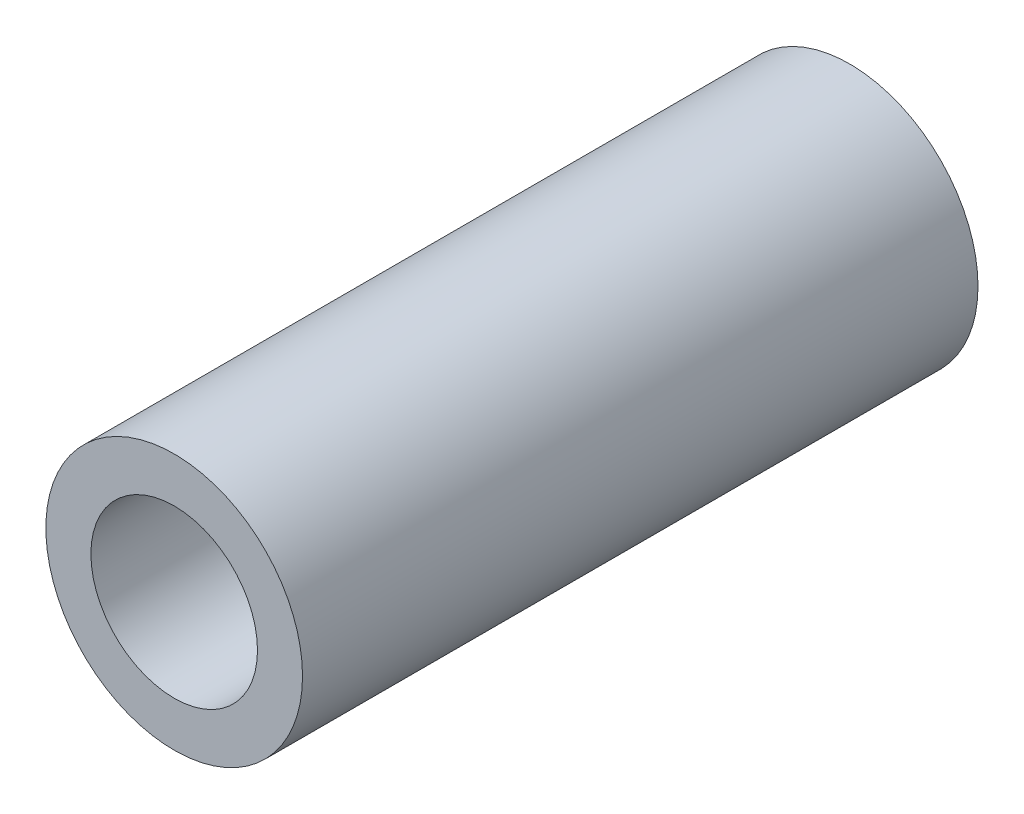
ISO-10303-21;
HEADER;
FILE_DESCRIPTION(('STEP AP214'),'2;1');
FILE_NAME('part.step','',(''),(''),'','','');
FILE_SCHEMA(('AUTOMOTIVE_DESIGN { 1 0 10303 214 1 1 1 1 }'));
ENDSEC;
DATA;
#1=APPLICATION_CONTEXT('core data for automotive mechanical design processes');
#2=APPLICATION_PROTOCOL_DEFINITION('international standard','automotive_design',2000,#1);
#3=PRODUCT_CONTEXT('',#1,'mechanical');
#4=PRODUCT('Part','Part','',(#3));
#5=PRODUCT_RELATED_PRODUCT_CATEGORY('part','',(#4));
#6=PRODUCT_DEFINITION_FORMATION('','',#4);
#7=PRODUCT_DEFINITION_CONTEXT('part definition',#1,'design');
#8=PRODUCT_DEFINITION('design','',#6,#7);
#9=PRODUCT_DEFINITION_SHAPE('','',#8);
#10=(LENGTH_UNIT() NAMED_UNIT(*) SI_UNIT(.MILLI.,.METRE.));
#11=(NAMED_UNIT(*) PLANE_ANGLE_UNIT() SI_UNIT($,.RADIAN.));
#12=(NAMED_UNIT(*) SI_UNIT($,.STERADIAN.) SOLID_ANGLE_UNIT());
#13=UNCERTAINTY_MEASURE_WITH_UNIT(LENGTH_MEASURE(1.E-05),#10,'distance_accuracy_value','');
#14=(GEOMETRIC_REPRESENTATION_CONTEXT(3) GLOBAL_UNCERTAINTY_ASSIGNED_CONTEXT((#13)) GLOBAL_UNIT_ASSIGNED_CONTEXT((#10,
#11,#12)) REPRESENTATION_CONTEXT('',''));
#15=CARTESIAN_POINT('',(0.,0.,0.));
#16=DIRECTION('',(0.,0.,1.));
#17=DIRECTION('',(1.,0.,0.));
#18=AXIS2_PLACEMENT_3D('',#15,#16,#17);
#19=CARTESIAN_POINT('',(0.,0.,15.));
#20=DIRECTION('',(0.,0.,1.));
#21=DIRECTION('',(1.,0.,0.));
#22=AXIS2_PLACEMENT_3D('',#19,#20,#21);
#23=PLANE('',#22);
#24=CARTESIAN_POINT('',(0.,0.,15.));
#25=DIRECTION('',(0.,0.,1.));
#26=DIRECTION('',(1.,0.,0.));
#27=AXIS2_PLACEMENT_3D('',#24,#25,#26);
#28=CIRCLE('',#27,2.85);
#29=CARTESIAN_POINT('',(2.85,0.,15.));
#30=VERTEX_POINT('',#29);
#31=EDGE_CURVE('E10',#30,#30,#28,.T.);
#32=ORIENTED_EDGE('',*,*,#31,.T.);
#33=EDGE_LOOP('',(#32));
#34=FACE_BOUND('',#33,.T.);
#35=CARTESIAN_POINT('',(0.,0.,15.));
#36=DIRECTION('',(0.,0.,1.));
#37=DIRECTION('',(1.,0.,0.));
#38=AXIS2_PLACEMENT_3D('',#35,#36,#37);
#39=CIRCLE('',#38,1.85);
#40=CARTESIAN_POINT('',(1.85,0.,15.));
#41=VERTEX_POINT('',#40);
#42=EDGE_CURVE('E44',#41,#41,#39,.T.);
#43=ORIENTED_EDGE('',*,*,#42,.F.);
#44=EDGE_LOOP('',(#43));
#45=FACE_BOUND('',#44,.T.);
#46=ADVANCED_FACE('F33',(#34,#45),#23,.T.);
#47=CARTESIAN_POINT('',(0.,0.,0.));
#48=DIRECTION('',(0.,0.,1.));
#49=DIRECTION('',(1.,0.,0.));
#50=AXIS2_PLACEMENT_3D('',#47,#48,#49);
#51=PLANE('',#50);
#52=CARTESIAN_POINT('',(0.,0.,0.));
#53=DIRECTION('',(0.,0.,1.));
#54=DIRECTION('',(1.,0.,0.));
#55=AXIS2_PLACEMENT_3D('',#52,#53,#54);
#56=CIRCLE('',#55,2.85);
#57=CARTESIAN_POINT('',(2.85,0.,0.));
#58=VERTEX_POINT('',#57);
#59=EDGE_CURVE('E37',#58,#58,#56,.T.);
#60=ORIENTED_EDGE('',*,*,#59,.F.);
#61=EDGE_LOOP('',(#60));
#62=FACE_BOUND('',#61,.T.);
#63=CARTESIAN_POINT('',(0.,0.,0.));
#64=DIRECTION('',(0.,0.,1.));
#65=DIRECTION('',(1.,0.,0.));
#66=AXIS2_PLACEMENT_3D('',#63,#64,#65);
#67=CIRCLE('',#66,1.85);
#68=CARTESIAN_POINT('',(1.85,0.,0.));
#69=VERTEX_POINT('',#68);
#70=EDGE_CURVE('E46',#69,#69,#67,.T.);
#71=ORIENTED_EDGE('',*,*,#70,.T.);
#72=EDGE_LOOP('',(#71));
#73=FACE_BOUND('',#72,.T.);
#74=ADVANCED_FACE('F56',(#62,#73),#51,.F.);
#75=CARTESIAN_POINT('',(0.,0.,15.));
#76=DIRECTION('',(0.,0.,-1.));
#77=DIRECTION('',(-1.,0.,0.));
#78=AXIS2_PLACEMENT_3D('',#75,#76,#77);
#79=CYLINDRICAL_SURFACE('',#78,2.85);
#80=ORIENTED_EDGE('',*,*,#31,.F.);
#81=EDGE_LOOP('',(#80));
#82=FACE_BOUND('',#81,.T.);
#83=ORIENTED_EDGE('',*,*,#59,.T.);
#84=EDGE_LOOP('',(#83));
#85=FACE_BOUND('',#84,.T.);
#86=ADVANCED_FACE('F35',(#82,#85),#79,.T.);
#87=CARTESIAN_POINT('',(0.,0.,15.));
#88=DIRECTION('',(0.,0.,-1.));
#89=DIRECTION('',(-1.,0.,0.));
#90=AXIS2_PLACEMENT_3D('',#87,#88,#89);
#91=CYLINDRICAL_SURFACE('',#90,1.85);
#92=ORIENTED_EDGE('',*,*,#42,.T.);
#93=EDGE_LOOP('',(#92));
#94=FACE_BOUND('',#93,.T.);
#95=ORIENTED_EDGE('',*,*,#70,.F.);
#96=EDGE_LOOP('',(#95));
#97=FACE_BOUND('',#96,.T.);
#98=ADVANCED_FACE('F52',(#94,#97),#91,.F.);
#99=CLOSED_SHELL('',(#46,#74,#86,#98));
#100=MANIFOLD_SOLID_BREP('B2',#99);
#101=ADVANCED_BREP_SHAPE_REPRESENTATION('',(#18,#100),#14);
#102=SHAPE_DEFINITION_REPRESENTATION(#9,#101);
ENDSEC;
END-ISO-10303-21;
